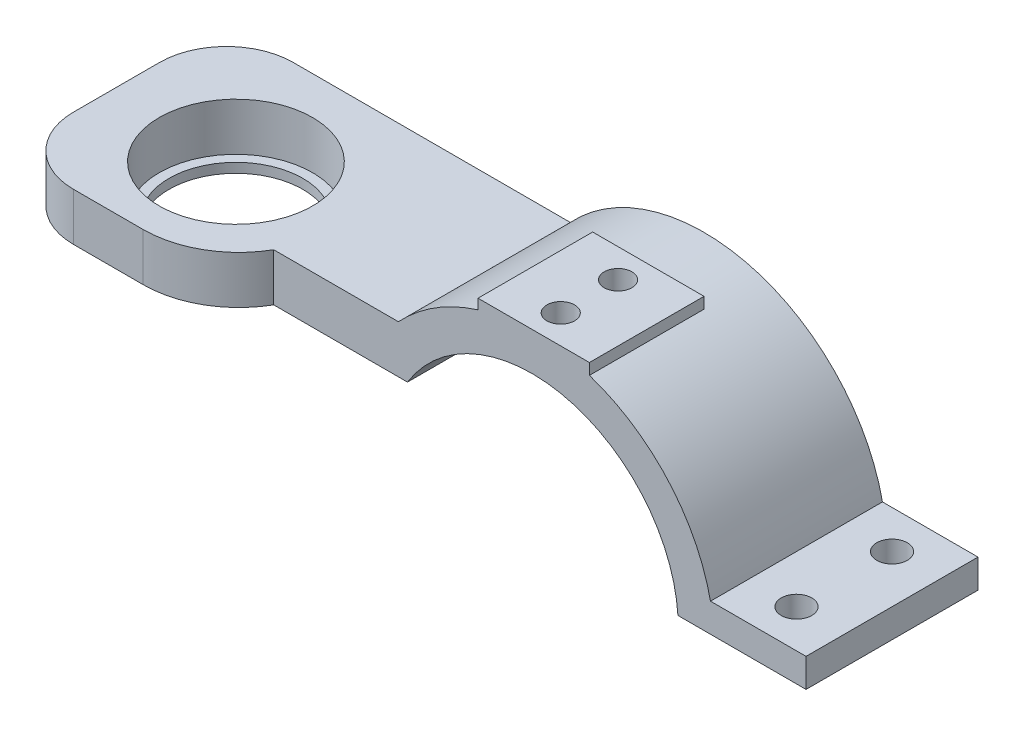
ISO-10303-21;
HEADER;
FILE_DESCRIPTION(('STEP AP214'),'2;1');
FILE_NAME('part.step','',(''),(''),'','','');
FILE_SCHEMA(('AUTOMOTIVE_DESIGN { 1 0 10303 214 1 1 1 1 }'));
ENDSEC;
DATA;
#1=APPLICATION_CONTEXT('core data for automotive mechanical design processes');
#2=APPLICATION_PROTOCOL_DEFINITION('international standard','automotive_design',2000,#1);
#3=PRODUCT_CONTEXT('',#1,'mechanical');
#4=PRODUCT('Part','Part','',(#3));
#5=PRODUCT_RELATED_PRODUCT_CATEGORY('part','',(#4));
#6=PRODUCT_DEFINITION_FORMATION('','',#4);
#7=PRODUCT_DEFINITION_CONTEXT('part definition',#1,'design');
#8=PRODUCT_DEFINITION('design','',#6,#7);
#9=PRODUCT_DEFINITION_SHAPE('','',#8);
#10=(LENGTH_UNIT() NAMED_UNIT(*) SI_UNIT(.MILLI.,.METRE.));
#11=(NAMED_UNIT(*) PLANE_ANGLE_UNIT() SI_UNIT($,.RADIAN.));
#12=(NAMED_UNIT(*) SI_UNIT($,.STERADIAN.) SOLID_ANGLE_UNIT());
#13=UNCERTAINTY_MEASURE_WITH_UNIT(LENGTH_MEASURE(1.E-05),#10,'distance_accuracy_value','');
#14=(GEOMETRIC_REPRESENTATION_CONTEXT(3) GLOBAL_UNCERTAINTY_ASSIGNED_CONTEXT((#13)) GLOBAL_UNIT_ASSIGNED_CONTEXT((#10,
#11,#12)) REPRESENTATION_CONTEXT('',''));
#15=CARTESIAN_POINT('',(0.,0.,0.));
#16=DIRECTION('',(0.,0.,1.));
#17=DIRECTION('',(1.,0.,0.));
#18=AXIS2_PLACEMENT_3D('',#15,#16,#17);
#19=CARTESIAN_POINT('',(0.,0.,18.));
#20=DIRECTION('',(0.,0.,1.));
#21=DIRECTION('',(1.,0.,0.));
#22=AXIS2_PLACEMENT_3D('',#19,#20,#21);
#23=PLANE('',#22);
#24=CARTESIAN_POINT('',(0.,0.,18.));
#25=DIRECTION('',(0.,0.,1.));
#26=DIRECTION('',(1.,0.,0.));
#27=AXIS2_PLACEMENT_3D('',#24,#25,#26);
#28=CIRCLE('',#27,19.1);
#29=CARTESIAN_POINT('',(18.6764557665527,4.,18.));
#30=VERTEX_POINT('',#29);
#31=CARTESIAN_POINT('',(6.,18.1331188712808,18.));
#32=VERTEX_POINT('',#31);
#33=EDGE_CURVE('E259',#30,#32,#28,.T.);
#34=ORIENTED_EDGE('',*,*,#33,.T.);
#35=DIRECTION('',(0.,1.,0.));
#36=VECTOR('',#35,1.);
#37=CARTESIAN_POINT('',(6.,18.1331188712808,18.));
#38=LINE('',#37,#36);
#39=CARTESIAN_POINT('',(6.,19.3,18.));
#40=VERTEX_POINT('',#39);
#41=EDGE_CURVE('E166',#32,#40,#38,.T.);
#42=ORIENTED_EDGE('',*,*,#41,.T.);
#43=DIRECTION('',(-1.,0.,0.));
#44=VECTOR('',#43,1.);
#45=CARTESIAN_POINT('',(6.,19.3,18.));
#46=LINE('',#45,#44);
#47=CARTESIAN_POINT('',(-5.66,19.3,18.));
#48=VERTEX_POINT('',#47);
#49=EDGE_CURVE('E410',#40,#48,#46,.T.);
#50=ORIENTED_EDGE('',*,*,#49,.T.);
#51=DIRECTION('',(0.,-1.,0.));
#52=VECTOR('',#51,1.);
#53=CARTESIAN_POINT('',(-5.66,19.3,18.));
#54=LINE('',#53,#52);
#55=CARTESIAN_POINT('',(-5.65999999999999,18.242105141677,18.));
#56=VERTEX_POINT('',#55);
#57=EDGE_CURVE('E61',#48,#56,#54,.T.);
#58=ORIENTED_EDGE('',*,*,#57,.T.);
#59=CARTESIAN_POINT('',(-13.9932126404196,13.,18.));
#60=VERTEX_POINT('',#59);
#61=EDGE_CURVE('E189',#56,#60,#28,.T.);
#62=ORIENTED_EDGE('',*,*,#61,.T.);
#63=DIRECTION('',(-1.,0.,0.));
#64=VECTOR('',#63,1.);
#65=CARTESIAN_POINT('',(-50.,13.,18.));
#66=LINE('',#65,#64);
#67=CARTESIAN_POINT('',(-27.0418556961807,13.,18.));
#68=VERTEX_POINT('',#67);
#69=EDGE_CURVE('E262',#60,#68,#66,.T.);
#70=ORIENTED_EDGE('',*,*,#69,.T.);
#71=DIRECTION('',(0.,-1.,0.));
#72=VECTOR('',#71,1.);
#73=CARTESIAN_POINT('',(-27.0418556961807,36.496305877201,18.));
#74=LINE('',#73,#72);
#75=CARTESIAN_POINT('',(-27.0418556961807,8.,18.));
#76=VERTEX_POINT('',#75);
#77=EDGE_CURVE('E222',#68,#76,#74,.T.);
#78=ORIENTED_EDGE('',*,*,#77,.T.);
#79=DIRECTION('',(1.,0.,0.));
#80=VECTOR('',#79,1.);
#81=CARTESIAN_POINT('',(-13.0418556961807,8.,18.));
#82=LINE('',#81,#80);
#83=CARTESIAN_POINT('',(-13.0418556961807,8.,18.));
#84=VERTEX_POINT('',#83);
#85=EDGE_CURVE('E266',#76,#84,#82,.T.);
#86=ORIENTED_EDGE('',*,*,#85,.T.);
#87=CARTESIAN_POINT('',(0.,0.,18.));
#88=DIRECTION('',(0.,0.,-1.));
#89=DIRECTION('',(1.,0.,0.));
#90=AXIS2_PLACEMENT_3D('',#87,#88,#89);
#91=CIRCLE('',#90,15.3);
#92=CARTESIAN_POINT('',(15.2672852858653,1.,18.));
#93=VERTEX_POINT('',#92);
#94=EDGE_CURVE('E245',#84,#93,#91,.T.);
#95=ORIENTED_EDGE('',*,*,#94,.T.);
#96=DIRECTION('',(1.,0.,0.));
#97=VECTOR('',#96,1.);
#98=CARTESIAN_POINT('',(15.2672852858653,1.,18.));
#99=LINE('',#98,#97);
#100=CARTESIAN_POINT('',(28.6764557665527,1.,18.));
#101=VERTEX_POINT('',#100);
#102=EDGE_CURVE('E249',#93,#101,#99,.T.);
#103=ORIENTED_EDGE('',*,*,#102,.T.);
#104=DIRECTION('',(0.,1.,0.));
#105=VECTOR('',#104,1.);
#106=CARTESIAN_POINT('',(28.6764557665527,4.,18.));
#107=LINE('',#106,#105);
#108=CARTESIAN_POINT('',(28.6764557665527,4.,18.));
#109=VERTEX_POINT('',#108);
#110=EDGE_CURVE('E253',#101,#109,#107,.T.);
#111=ORIENTED_EDGE('',*,*,#110,.T.);
#112=DIRECTION('',(-1.,0.,0.));
#113=VECTOR('',#112,1.);
#114=CARTESIAN_POINT('',(18.6764557665527,4.,18.));
#115=LINE('',#114,#113);
#116=EDGE_CURVE('E256',#109,#30,#115,.T.);
#117=ORIENTED_EDGE('',*,*,#116,.T.);
#118=EDGE_LOOP('',(#34,#42,#50,#58,#62,#70,#78,#86,#95,#103,#111,#117));
#119=FACE_BOUND('',#118,.T.);
#120=ADVANCED_FACE('F45',(#119),#23,.T.);
#121=CARTESIAN_POINT('',(0.,0.,18.));
#122=DIRECTION('',(0.,0.,-1.));
#123=DIRECTION('',(-1.,0.,0.));
#124=AXIS2_PLACEMENT_3D('',#121,#122,#123);
#125=CYLINDRICAL_SURFACE('',#124,15.3);
#126=CARTESIAN_POINT('',(0.,15.3,16.45));
#127=CARTESIAN_POINT('',(0.0812515991142667,15.2999991091432,16.4499964709198));
#128=CARTESIAN_POINT('',(0.16255744898968,15.2993458775758,16.443147542065));
#129=CARTESIAN_POINT('',(0.322916548267007,15.2968028186071,16.4159283613467));
#130=CARTESIAN_POINT('',(0.401967190413606,15.2949116159926,16.3955430721103));
#131=CARTESIAN_POINT('',(0.555470386419923,15.2901061751943,16.3418486228883));
#132=CARTESIAN_POINT('',(0.629925628930525,15.28719254201,16.3085471045573));
#133=CARTESIAN_POINT('',(0.772172919661824,15.2806683523542,16.2299799604515));
#134=CARTESIAN_POINT('',(0.839966322342499,15.2770579379938,16.1847167736109));
#135=CARTESIAN_POINT('',(0.967202576648075,15.269531734915,16.0833530276106));
#136=CARTESIAN_POINT('',(1.02662075828161,15.2656150947734,16.0272215619558));
#137=CARTESIAN_POINT('',(1.13520798076871,15.2579249442009,15.9057803788205));
#138=CARTESIAN_POINT('',(1.18437655567673,15.2541514402833,15.8404702443049));
#139=CARTESIAN_POINT('',(1.27115507340336,15.2471659813123,15.7023727293474));
#140=CARTESIAN_POINT('',(1.30874288476061,15.2439551064594,15.6295713824857));
#141=CARTESIAN_POINT('',(1.37115156566787,15.2384687758788,15.4786550089068));
#142=CARTESIAN_POINT('',(1.39597272054443,15.2361932992458,15.4005401009883));
#143=CARTESIAN_POINT('',(1.43207083921573,15.2328429442271,15.2414643266713));
#144=CARTESIAN_POINT('',(1.44338851000812,15.231764458137,15.160512774918));
#145=CARTESIAN_POINT('',(1.45228420106818,15.230918935861,14.9978524685594));
#146=CARTESIAN_POINT('',(1.44986254799758,15.2311518684952,14.9161437320028));
#147=CARTESIAN_POINT('',(1.43138191405666,15.2328995752187,14.7545685243348));
#148=CARTESIAN_POINT('',(1.41536731053698,15.234410178,14.6746969259849));
#149=CARTESIAN_POINT('',(1.37022438665792,15.2385364945202,14.518780354853));
#150=CARTESIAN_POINT('',(1.34109590542635,15.2411522218159,14.4427354290267));
#151=CARTESIAN_POINT('',(1.27050285874312,15.2471988631139,14.2964902404687));
#152=CARTESIAN_POINT('',(1.22901853087671,15.2506310812593,14.2262995732322));
#153=CARTESIAN_POINT('',(1.1349055939976,15.2579228460782,14.0938603356113));
#154=CARTESIAN_POINT('',(1.08227669224086,15.261782403976,14.031611973923));
#155=CARTESIAN_POINT('',(0.967120343511109,15.2695125534767,13.916566422873));
#156=CARTESIAN_POINT('',(0.90455455804106,15.2733831283201,13.8638076001931));
#157=CARTESIAN_POINT('',(0.771433789286605,15.2806847360842,13.7695358848851));
#158=CARTESIAN_POINT('',(0.700878798369754,15.284115768585,13.7280230030009));
#159=CARTESIAN_POINT('',(0.553756380980498,15.2901526701683,13.6574233894373));
#160=CARTESIAN_POINT('',(0.477188054543367,15.2927584154423,13.6283385219644));
#161=CARTESIAN_POINT('',(0.320224630496182,15.2968498365577,13.5834482491451));
#162=CARTESIAN_POINT('',(0.239829635703252,15.2983355424748,13.5676424872206));
#163=CARTESIAN_POINT('',(0.0778273497443185,15.3000156246718,13.5498075759987));
#164=CARTESIAN_POINT('',(-0.0037740616934729,15.3002149650309,13.5477254665168));
#165=CARTESIAN_POINT('',(-0.166164710833336,15.2993131492001,13.5572579854139));
#166=CARTESIAN_POINT('',(-0.246953958360673,15.2982120087622,13.5688724478953));
#167=CARTESIAN_POINT('',(-0.405274728054278,15.2948361843755,13.6054244958345));
#168=CARTESIAN_POINT('',(-0.482812006407379,15.2925636775976,13.6303373671276));
#169=CARTESIAN_POINT('',(-0.632606558132375,15.2871001764658,13.6927537016806));
#170=CARTESIAN_POINT('',(-0.704863724578483,15.2839091635179,13.7302574198276));
#171=CARTESIAN_POINT('',(-0.842286908482688,15.2769534716161,13.8169227786372));
#172=CARTESIAN_POINT('',(-0.907430833718773,15.2731870879733,13.8661193114166));
#173=CARTESIAN_POINT('',(-1.02855491693736,15.2655090069387,13.9747236370309));
#174=CARTESIAN_POINT('',(-1.08453486860725,15.2615973062777,14.0341316597));
#175=CARTESIAN_POINT('',(-1.18592508547687,15.2540546066878,14.1617032525118));
#176=CARTESIAN_POINT('',(-1.23130065836996,15.2504245543453,14.2298944589093));
#177=CARTESIAN_POINT('',(-1.30995578792696,15.2438702511028,14.3729599960022));
#178=CARTESIAN_POINT('',(-1.34323549532968,15.2409459914072,14.4478342433989));
#179=CARTESIAN_POINT('',(-1.39669578682737,15.2361400988762,14.6020201958947));
#180=CARTESIAN_POINT('',(-1.41689721070976,15.2342568079972,14.681324621483));
#181=CARTESIAN_POINT('',(-1.44369518774856,15.2317408146306,14.8422185285275));
#182=CARTESIAN_POINT('',(-1.4502920879007,15.2311080802465,14.923807951649));
#183=CARTESIAN_POINT('',(-1.44968921325221,15.2311654471207,15.0866110355672));
#184=CARTESIAN_POINT('',(-1.4425439386099,15.231850322866,15.1678249055439));
#185=CARTESIAN_POINT('',(-1.41477360506399,15.2344546133188,15.3278932145747));
#186=CARTESIAN_POINT('',(-1.3941485290337,15.2363740295947,15.4067476506308));
#187=CARTESIAN_POINT('',(-1.3400187034686,15.2412297073439,15.5598595833221));
#188=CARTESIAN_POINT('',(-1.30651535409957,15.2441658582711,15.6341175786779));
#189=CARTESIAN_POINT('',(-1.2275857666815,15.2507243943616,15.7759645145542));
#190=CARTESIAN_POINT('',(-1.1821596352912,15.2543467733859,15.8435535147266));
#191=CARTESIAN_POINT('',(-1.0804691148909,15.2618867936987,15.970423121208));
#192=CARTESIAN_POINT('',(-1.02416417105721,15.2658055053246,16.0296711582808));
#193=CARTESIAN_POINT('',(-0.902392878387768,15.2734868560174,16.1379030469461));
#194=CARTESIAN_POINT('',(-0.836924331174346,15.2772494573514,16.1868844284722));
#195=CARTESIAN_POINT('',(-0.69852226194242,15.2842034493593,16.2732789413874));
#196=CARTESIAN_POINT('',(-0.625571945127441,15.2873935086706,16.3106652533046));
#197=CARTESIAN_POINT('',(-0.474446545448694,15.2928281938523,16.3726087441107));
#198=CARTESIAN_POINT('',(-0.396277506200712,15.2950738920792,16.3971804820746));
#199=CARTESIAN_POINT('',(-0.264716351117885,15.2977984651584,16.426626561583));
#200=CARTESIAN_POINT('',(-0.212166999669702,15.2986202215285,16.4353797342677));
#201=CARTESIAN_POINT('',(-0.106419522696149,15.2997212797339,16.4470675987753));
#202=CARTESIAN_POINT('',(-0.0532213995151396,15.3000005835288,16.4500023116171));
#203=CARTESIAN_POINT('',(0.,15.3,16.45));
#204=B_SPLINE_CURVE_WITH_KNOTS('',3,(#126,#127,#128,#129,#130,#131,#132,#133,#134,#135,#136,
#137,#138,#139,#140,#141,#142,#143,#144,#145,#146,#147,#148,#149,#150,#151,#152,#153,#154,#155,
#156,#157,#158,#159,#160,#161,#162,#163,#164,#165,#166,#167,#168,#169,#170,#171,#172,#173,#174,
#175,#176,#177,#178,#179,#180,#181,#182,#183,#184,#185,#186,#187,#188,#189,#190,#191,#192,#193,
#194,#195,#196,#197,#198,#199,#200,#201,#202,#203),.UNSPECIFIED.,.T.,.F.,(4,2,2,2,2,2,2,2,2,2,2,
2,2,2,2,2,2,2,2,2,2,2,2,2,2,2,2,2,2,2,2,2,2,2,2,2,2,2,4),(0.,0.243560462248795,
0.487391946423289,0.731079391599901,0.974717188212017,1.21905828097242,1.46341047902038,
1.70822679150146,1.95303763225799,2.19710859742689,2.4411737596676,2.6844451656828,
2.92771955606851,3.17138515766205,3.41505716062242,3.65969321974091,3.90432951257313,
4.14900248806394,4.39366889324752,4.637390564306,4.88110928335126,5.124376637073,
5.36764891575645,5.61165645641248,5.85566948976357,6.10046997503975,6.34526740950471,
6.58967380139682,6.83407395940485,7.07750684801378,7.32094004591551,7.56434678448848,
7.80775134566935,8.05208143334323,8.29647023737089,8.54142016966889,8.7860911963558,
8.9456286779067,9.10516558313369),.UNSPECIFIED.);
#205=CARTESIAN_POINT('',(0.,15.3,16.45));
#206=VERTEX_POINT('',#205);
#207=EDGE_CURVE('E412',#206,#206,#204,.T.);
#208=ORIENTED_EDGE('',*,*,#207,.T.);
#209=EDGE_LOOP('',(#208));
#210=FACE_BOUND('',#209,.T.);
#211=CARTESIAN_POINT('',(0.,15.3,10.45));
#212=CARTESIAN_POINT('',(0.0812515991142664,15.2999991091432,10.4499964709198));
#213=CARTESIAN_POINT('',(0.162557448989679,15.2993458775758,10.443147542065));
#214=CARTESIAN_POINT('',(0.322916548267007,15.2968028186071,10.4159283613467));
#215=CARTESIAN_POINT('',(0.401967190413606,15.2949116159926,10.3955430721103));
#216=CARTESIAN_POINT('',(0.555470386419923,15.2901061751943,10.3418486228883));
#217=CARTESIAN_POINT('',(0.629925628930526,15.28719254201,10.3085471045573));
#218=CARTESIAN_POINT('',(0.772172919661824,15.2806683523542,10.2299799604515));
#219=CARTESIAN_POINT('',(0.839966322342499,15.2770579379938,10.1847167736109));
#220=CARTESIAN_POINT('',(0.967202576648075,15.269531734915,10.0833530276106));
#221=CARTESIAN_POINT('',(1.02662075828161,15.2656150947734,10.0272215619558));
#222=CARTESIAN_POINT('',(1.13520798076871,15.2579249442009,9.90578037882047));
#223=CARTESIAN_POINT('',(1.18437655567673,15.2541514402833,9.84047024430494));
#224=CARTESIAN_POINT('',(1.27115507340337,15.2471659813123,9.70237272934738));
#225=CARTESIAN_POINT('',(1.30874288476061,15.2439551064594,9.62957138248573));
#226=CARTESIAN_POINT('',(1.37115156566787,15.2384687758788,9.47865500890677));
#227=CARTESIAN_POINT('',(1.39597272054443,15.2361932992458,9.40054010098831));
#228=CARTESIAN_POINT('',(1.43207083921573,15.2328429442271,9.24146432667128));
#229=CARTESIAN_POINT('',(1.44338851000812,15.231764458137,9.16051277491802));
#230=CARTESIAN_POINT('',(1.45228420106818,15.230918935861,8.99785246855942));
#231=CARTESIAN_POINT('',(1.44986254799758,15.2311518684952,8.91614373200277));
#232=CARTESIAN_POINT('',(1.43138191405666,15.2328995752187,8.75456852433481));
#233=CARTESIAN_POINT('',(1.41536731053698,15.234410178,8.67469692598487));
#234=CARTESIAN_POINT('',(1.37022438665792,15.2385364945202,8.51878035485296));
#235=CARTESIAN_POINT('',(1.34109590542635,15.2411522218159,8.44273542902675));
#236=CARTESIAN_POINT('',(1.27050285874312,15.2471988631139,8.2964902404687));
#237=CARTESIAN_POINT('',(1.22901853087671,15.2506310812593,8.22629957323224));
#238=CARTESIAN_POINT('',(1.1349055939976,15.2579228460782,8.09386033561128));
#239=CARTESIAN_POINT('',(1.08227669224087,15.261782403976,8.03161197392297));
#240=CARTESIAN_POINT('',(0.967120343511111,15.2695125534767,7.91656642287304));
#241=CARTESIAN_POINT('',(0.904554558041061,15.2733831283201,7.86380760019306));
#242=CARTESIAN_POINT('',(0.771433789286606,15.2806847360842,7.76953588488506));
#243=CARTESIAN_POINT('',(0.700878798369754,15.284115768585,7.72802300300092));
#244=CARTESIAN_POINT('',(0.553756380980498,15.2901526701683,7.65742338943734));
#245=CARTESIAN_POINT('',(0.477188054543367,15.2927584154423,7.62833852196441));
#246=CARTESIAN_POINT('',(0.320224630496182,15.2968498365577,7.58344824914506));
#247=CARTESIAN_POINT('',(0.239829635703252,15.2983355424748,7.5676424872206));
#248=CARTESIAN_POINT('',(0.0778273497443191,15.3000156246718,7.54980757599874));
#249=CARTESIAN_POINT('',(-0.00377406169347209,15.3002149650309,7.54772546651675));
#250=CARTESIAN_POINT('',(-0.166164710833335,15.2993131492001,7.55725798541393));
#251=CARTESIAN_POINT('',(-0.246953958360672,15.2982120087622,7.56887244789535));
#252=CARTESIAN_POINT('',(-0.405274728054277,15.2948361843755,7.60542449583449));
#253=CARTESIAN_POINT('',(-0.482812006407379,15.2925636775976,7.63033736712763));
#254=CARTESIAN_POINT('',(-0.632606558132375,15.2871001764658,7.69275370168063));
#255=CARTESIAN_POINT('',(-0.704863724578482,15.2839091635179,7.73025741982755));
#256=CARTESIAN_POINT('',(-0.842286908482687,15.2769534716161,7.81692277863721));
#257=CARTESIAN_POINT('',(-0.907430833718773,15.2731870879733,7.86611931141658));
#258=CARTESIAN_POINT('',(-1.02855491693736,15.2655090069387,7.9747236370309));
#259=CARTESIAN_POINT('',(-1.08453486860725,15.2615973062777,8.03413165969997));
#260=CARTESIAN_POINT('',(-1.18592508547687,15.2540546066878,8.16170325251179));
#261=CARTESIAN_POINT('',(-1.23130065836996,15.2504245543453,8.22989445890932));
#262=CARTESIAN_POINT('',(-1.30995578792696,15.2438702511028,8.37295999600219));
#263=CARTESIAN_POINT('',(-1.34323549532968,15.2409459914072,8.44783424339892));
#264=CARTESIAN_POINT('',(-1.39669578682737,15.2361400988762,8.6020201958947));
#265=CARTESIAN_POINT('',(-1.41689721070976,15.2342568079972,8.68132462148301));
#266=CARTESIAN_POINT('',(-1.44369518774856,15.2317408146306,8.84221852852752));
#267=CARTESIAN_POINT('',(-1.4502920879007,15.2311080802465,8.92380795164899));
#268=CARTESIAN_POINT('',(-1.44968921325221,15.2311654471207,9.08661103556718));
#269=CARTESIAN_POINT('',(-1.4425439386099,15.231850322866,9.16782490554394));
#270=CARTESIAN_POINT('',(-1.41477360506399,15.2344546133188,9.32789321457468));
#271=CARTESIAN_POINT('',(-1.3941485290337,15.2363740295947,9.40674765063076));
#272=CARTESIAN_POINT('',(-1.3400187034686,15.2412297073439,9.55985958332207));
#273=CARTESIAN_POINT('',(-1.30651535409957,15.2441658582711,9.63411757867791));
#274=CARTESIAN_POINT('',(-1.2275857666815,15.2507243943616,9.77596451455418));
#275=CARTESIAN_POINT('',(-1.1821596352912,15.2543467733859,9.84355351472663));
#276=CARTESIAN_POINT('',(-1.0804691148909,15.2618867936987,9.97042312120795));
#277=CARTESIAN_POINT('',(-1.02416417105721,15.2658055053246,10.0296711582808));
#278=CARTESIAN_POINT('',(-0.902392878387768,15.2734868560174,10.1379030469461));
#279=CARTESIAN_POINT('',(-0.836924331174346,15.2772494573514,10.1868844284722));
#280=CARTESIAN_POINT('',(-0.698522261942419,15.2842034493593,10.2732789413874));
#281=CARTESIAN_POINT('',(-0.625571945127441,15.2873935086706,10.3106652533046));
#282=CARTESIAN_POINT('',(-0.474446545448695,15.2928281938523,10.3726087441107));
#283=CARTESIAN_POINT('',(-0.396277506200714,15.2950738920792,10.3971804820746));
#284=CARTESIAN_POINT('',(-0.264716351117886,15.2977984651584,10.426626561583));
#285=CARTESIAN_POINT('',(-0.212166999669702,15.2986202215285,10.4353797342677));
#286=CARTESIAN_POINT('',(-0.106419522696149,15.2997212797339,10.4470675987753));
#287=CARTESIAN_POINT('',(-0.0532213995151395,15.3000005835288,10.4500023116171));
#288=CARTESIAN_POINT('',(0.,15.3,10.45));
#289=B_SPLINE_CURVE_WITH_KNOTS('',3,(#211,#212,#213,#214,#215,#216,#217,#218,#219,#220,#221,
#222,#223,#224,#225,#226,#227,#228,#229,#230,#231,#232,#233,#234,#235,#236,#237,#238,#239,#240,
#241,#242,#243,#244,#245,#246,#247,#248,#249,#250,#251,#252,#253,#254,#255,#256,#257,#258,#259,
#260,#261,#262,#263,#264,#265,#266,#267,#268,#269,#270,#271,#272,#273,#274,#275,#276,#277,#278,
#279,#280,#281,#282,#283,#284,#285,#286,#287,#288),.UNSPECIFIED.,.T.,.F.,(4,2,2,2,2,2,2,2,2,2,2,
2,2,2,2,2,2,2,2,2,2,2,2,2,2,2,2,2,2,2,2,2,2,2,2,2,2,2,4),(0.,0.243560462248794,
0.487391946423288,0.731079391599903,0.974717188212017,1.21905828097242,1.46341047902038,
1.70822679150146,1.95303763225799,2.19710859742689,2.4411737596676,2.6844451656828,
2.92771955606851,3.17138515766205,3.41505716062242,3.6596932197409,3.90432951257313,
4.14900248806394,4.39366889324752,4.637390564306,4.88110928335126,5.124376637073,
5.36764891575645,5.61165645641248,5.85566948976357,6.10046997503975,6.34526740950471,
6.58967380139682,6.83407395940485,7.07750684801379,7.32094004591551,7.56434678448849,
7.80775134566935,8.05208143334324,8.29647023737089,8.54142016966889,8.78609119635581,
8.9456286779067,9.1051655831337),.UNSPECIFIED.);
#290=CARTESIAN_POINT('',(0.,15.3,10.45));
#291=VERTEX_POINT('',#290);
#292=EDGE_CURVE('E417',#291,#291,#289,.T.);
#293=ORIENTED_EDGE('',*,*,#292,.T.);
#294=EDGE_LOOP('',(#293));
#295=FACE_BOUND('',#294,.T.);
#296=CARTESIAN_POINT('',(0.,0.,0.));
#297=DIRECTION('',(0.,0.,-1.));
#298=DIRECTION('',(1.,0.,0.));
#299=AXIS2_PLACEMENT_3D('',#296,#297,#298);
#300=CIRCLE('',#299,15.3);
#301=CARTESIAN_POINT('',(-13.0418556961807,8.,0.));
#302=VERTEX_POINT('',#301);
#303=CARTESIAN_POINT('',(15.2672852858653,1.,0.));
#304=VERTEX_POINT('',#303);
#305=EDGE_CURVE('E233',#302,#304,#300,.T.);
#306=ORIENTED_EDGE('',*,*,#305,.T.);
#307=DIRECTION('',(0.,0.,-1.));
#308=VECTOR('',#307,1.);
#309=CARTESIAN_POINT('',(15.2672852858653,1.,18.));
#310=LINE('',#309,#308);
#311=EDGE_CURVE('E318',#93,#304,#310,.T.);
#312=ORIENTED_EDGE('',*,*,#311,.F.);
#313=ORIENTED_EDGE('',*,*,#94,.F.);
#314=DIRECTION('',(0.,0.,-1.));
#315=VECTOR('',#314,1.);
#316=CARTESIAN_POINT('',(-13.0418556961807,8.,18.));
#317=LINE('',#316,#315);
#318=EDGE_CURVE('E269',#84,#302,#317,.T.);
#319=ORIENTED_EDGE('',*,*,#318,.T.);
#320=EDGE_LOOP('',(#306,#312,#313,#319));
#321=FACE_BOUND('',#320,.T.);
#322=ADVANCED_FACE('F394',(#210,#295,#321),#125,.F.);
#323=CARTESIAN_POINT('',(15.2672852858653,1.,18.));
#324=DIRECTION('',(0.,1.,0.));
#325=DIRECTION('',(0.,0.,1.));
#326=AXIS2_PLACEMENT_3D('',#323,#324,#325);
#327=PLANE('',#326);
#328=CARTESIAN_POINT('',(23.6764557665527,1.,4.));
#329=DIRECTION('',(0.,1.,0.));
#330=DIRECTION('',(0.,0.,1.));
#331=AXIS2_PLACEMENT_3D('',#328,#329,#330);
#332=CIRCLE('',#331,1.6);
#333=CARTESIAN_POINT('',(23.6764557665527,1.,5.6));
#334=VERTEX_POINT('',#333);
#335=EDGE_CURVE('E229',#334,#334,#332,.T.);
#336=ORIENTED_EDGE('',*,*,#335,.T.);
#337=EDGE_LOOP('',(#336));
#338=FACE_BOUND('',#337,.T.);
#339=CARTESIAN_POINT('',(23.6764557665527,1.,14.));
#340=DIRECTION('',(0.,1.,0.));
#341=DIRECTION('',(0.,0.,1.));
#342=AXIS2_PLACEMENT_3D('',#339,#340,#341);
#343=CIRCLE('',#342,1.6);
#344=CARTESIAN_POINT('',(23.6764557665527,1.,15.6));
#345=VERTEX_POINT('',#344);
#346=EDGE_CURVE('E221',#345,#345,#343,.T.);
#347=ORIENTED_EDGE('',*,*,#346,.T.);
#348=EDGE_LOOP('',(#347));
#349=FACE_BOUND('',#348,.T.);
#350=DIRECTION('',(1.,0.,0.));
#351=VECTOR('',#350,1.);
#352=CARTESIAN_POINT('',(15.2672852858653,1.,0.));
#353=LINE('',#352,#351);
#354=CARTESIAN_POINT('',(28.6764557665527,1.,0.));
#355=VERTEX_POINT('',#354);
#356=EDGE_CURVE('E273',#304,#355,#353,.T.);
#357=ORIENTED_EDGE('',*,*,#356,.T.);
#358=DIRECTION('',(0.,0.,-1.));
#359=VECTOR('',#358,1.);
#360=CARTESIAN_POINT('',(28.6764557665527,1.,18.));
#361=LINE('',#360,#359);
#362=EDGE_CURVE('E314',#101,#355,#361,.T.);
#363=ORIENTED_EDGE('',*,*,#362,.F.);
#364=ORIENTED_EDGE('',*,*,#102,.F.);
#365=ORIENTED_EDGE('',*,*,#311,.T.);
#366=EDGE_LOOP('',(#357,#363,#364,#365));
#367=FACE_BOUND('',#366,.T.);
#368=ADVANCED_FACE('F400',(#338,#349,#367),#327,.F.);
#369=CARTESIAN_POINT('',(28.6764557665527,4.,18.));
#370=DIRECTION('',(-1.,0.,0.));
#371=DIRECTION('',(0.,0.,1.));
#372=AXIS2_PLACEMENT_3D('',#369,#370,#371);
#373=PLANE('',#372);
#374=DIRECTION('',(0.,1.,0.));
#375=VECTOR('',#374,1.);
#376=CARTESIAN_POINT('',(28.6764557665527,4.,0.));
#377=LINE('',#376,#375);
#378=CARTESIAN_POINT('',(28.6764557665527,4.,0.));
#379=VERTEX_POINT('',#378);
#380=EDGE_CURVE('E276',#355,#379,#377,.T.);
#381=ORIENTED_EDGE('',*,*,#380,.T.);
#382=DIRECTION('',(0.,0.,-1.));
#383=VECTOR('',#382,1.);
#384=CARTESIAN_POINT('',(28.6764557665527,4.,18.));
#385=LINE('',#384,#383);
#386=EDGE_CURVE('E310',#109,#379,#385,.T.);
#387=ORIENTED_EDGE('',*,*,#386,.F.);
#388=ORIENTED_EDGE('',*,*,#110,.F.);
#389=ORIENTED_EDGE('',*,*,#362,.T.);
#390=EDGE_LOOP('',(#381,#387,#388,#389));
#391=FACE_BOUND('',#390,.T.);
#392=ADVANCED_FACE('F402',(#391),#373,.F.);
#393=CARTESIAN_POINT('',(18.6764557665527,4.,18.));
#394=DIRECTION('',(0.,-1.,0.));
#395=DIRECTION('',(0.,0.,-1.));
#396=AXIS2_PLACEMENT_3D('',#393,#394,#395);
#397=PLANE('',#396);
#398=CARTESIAN_POINT('',(23.6764557665527,4.,4.));
#399=DIRECTION('',(0.,1.,0.));
#400=DIRECTION('',(0.,0.,1.));
#401=AXIS2_PLACEMENT_3D('',#398,#399,#400);
#402=CIRCLE('',#401,1.6);
#403=CARTESIAN_POINT('',(23.6764557665527,4.,5.6));
#404=VERTEX_POINT('',#403);
#405=EDGE_CURVE('E234',#404,#404,#402,.T.);
#406=ORIENTED_EDGE('',*,*,#405,.F.);
#407=EDGE_LOOP('',(#406));
#408=FACE_BOUND('',#407,.T.);
#409=CARTESIAN_POINT('',(23.6764557665527,4.,14.));
#410=DIRECTION('',(0.,1.,0.));
#411=DIRECTION('',(0.,0.,1.));
#412=AXIS2_PLACEMENT_3D('',#409,#410,#411);
#413=CIRCLE('',#412,1.6);
#414=CARTESIAN_POINT('',(23.6764557665527,4.,15.6));
#415=VERTEX_POINT('',#414);
#416=EDGE_CURVE('E238',#415,#415,#413,.T.);
#417=ORIENTED_EDGE('',*,*,#416,.F.);
#418=EDGE_LOOP('',(#417));
#419=FACE_BOUND('',#418,.T.);
#420=DIRECTION('',(-1.,0.,0.));
#421=VECTOR('',#420,1.);
#422=CARTESIAN_POINT('',(18.6764557665527,4.,0.));
#423=LINE('',#422,#421);
#424=CARTESIAN_POINT('',(18.6764557665527,4.,0.));
#425=VERTEX_POINT('',#424);
#426=EDGE_CURVE('E279',#379,#425,#423,.T.);
#427=ORIENTED_EDGE('',*,*,#426,.T.);
#428=DIRECTION('',(0.,0.,-1.));
#429=VECTOR('',#428,1.);
#430=CARTESIAN_POINT('',(18.6764557665527,4.,18.));
#431=LINE('',#430,#429);
#432=EDGE_CURVE('E306',#30,#425,#431,.T.);
#433=ORIENTED_EDGE('',*,*,#432,.F.);
#434=ORIENTED_EDGE('',*,*,#116,.F.);
#435=ORIENTED_EDGE('',*,*,#386,.T.);
#436=EDGE_LOOP('',(#427,#433,#434,#435));
#437=FACE_BOUND('',#436,.T.);
#438=ADVANCED_FACE('F407',(#408,#419,#437),#397,.F.);
#439=CARTESIAN_POINT('',(0.,0.,18.));
#440=DIRECTION('',(0.,0.,-1.));
#441=DIRECTION('',(-1.,0.,0.));
#442=AXIS2_PLACEMENT_3D('',#439,#440,#441);
#443=CYLINDRICAL_SURFACE('',#442,19.1);
#444=ORIENTED_EDGE('',*,*,#61,.F.);
#445=DIRECTION('',(0.,0.,1.));
#446=VECTOR('',#445,1.);
#447=CARTESIAN_POINT('',(-5.66,18.242105141677,6.));
#448=LINE('',#447,#446);
#449=CARTESIAN_POINT('',(-5.66,18.242105141677,6.));
#450=VERTEX_POINT('',#449);
#451=EDGE_CURVE('E187',#450,#56,#448,.T.);
#452=ORIENTED_EDGE('',*,*,#451,.F.);
#453=CARTESIAN_POINT('',(0.,0.,6.));
#454=DIRECTION('',(0.,0.,1.));
#455=DIRECTION('',(1.,0.,0.));
#456=AXIS2_PLACEMENT_3D('',#453,#454,#455);
#457=CIRCLE('',#456,19.1);
#458=CARTESIAN_POINT('',(6.,18.1331188712808,6.));
#459=VERTEX_POINT('',#458);
#460=EDGE_CURVE('E11',#459,#450,#457,.T.);
#461=ORIENTED_EDGE('',*,*,#460,.F.);
#462=DIRECTION('',(0.,0.,1.));
#463=VECTOR('',#462,1.);
#464=CARTESIAN_POINT('',(6.,18.1331188712808,6.));
#465=LINE('',#464,#463);
#466=EDGE_CURVE('E161',#459,#32,#465,.T.);
#467=ORIENTED_EDGE('',*,*,#466,.T.);
#468=ORIENTED_EDGE('',*,*,#33,.F.);
#469=ORIENTED_EDGE('',*,*,#432,.T.);
#470=CARTESIAN_POINT('',(0.,0.,0.));
#471=DIRECTION('',(0.,0.,1.));
#472=DIRECTION('',(1.,0.,0.));
#473=AXIS2_PLACEMENT_3D('',#470,#471,#472);
#474=CIRCLE('',#473,19.1);
#475=CARTESIAN_POINT('',(-13.9932126404196,13.,0.));
#476=VERTEX_POINT('',#475);
#477=EDGE_CURVE('E282',#425,#476,#474,.T.);
#478=ORIENTED_EDGE('',*,*,#477,.T.);
#479=DIRECTION('',(0.,0.,-1.));
#480=VECTOR('',#479,1.);
#481=CARTESIAN_POINT('',(-13.9932126404196,13.,18.));
#482=LINE('',#481,#480);
#483=EDGE_CURVE('E302',#60,#476,#482,.T.);
#484=ORIENTED_EDGE('',*,*,#483,.F.);
#485=EDGE_LOOP('',(#444,#452,#461,#467,#468,#469,#478,#484));
#486=FACE_BOUND('',#485,.T.);
#487=ADVANCED_FACE('F186',(#486),#443,.T.);
#488=CARTESIAN_POINT('',(-50.,13.,18.));
#489=DIRECTION('',(0.,-1.,0.));
#490=DIRECTION('',(0.,0.,-1.));
#491=AXIS2_PLACEMENT_3D('',#488,#489,#490);
#492=PLANE('',#491);
#493=CARTESIAN_POINT('',(-37.,13.,12.));
#494=DIRECTION('',(0.,1.,0.));
#495=DIRECTION('',(-1.,0.,0.));
#496=AXIS2_PLACEMENT_3D('',#493,#494,#495);
#497=CIRCLE('',#496,8.025);
#498=CARTESIAN_POINT('',(-45.025,13.,12.));
#499=VERTEX_POINT('',#498);
#500=EDGE_CURVE('E213',#499,#499,#497,.T.);
#501=ORIENTED_EDGE('',*,*,#500,.F.);
#502=EDGE_LOOP('',(#501));
#503=FACE_BOUND('',#502,.T.);
#504=DIRECTION('',(1.,0.,0.));
#505=VECTOR('',#504,1.);
#506=CARTESIAN_POINT('',(-27.0418556961807,13.,23.));
#507=LINE('',#506,#505);
#508=CARTESIAN_POINT('',(-43.,13.,23.));
#509=VERTEX_POINT('',#508);
#510=CARTESIAN_POINT('',(-35.7021097340251,13.,23.));
#511=VERTEX_POINT('',#510);
#512=EDGE_CURVE('E218',#509,#511,#507,.T.);
#513=ORIENTED_EDGE('',*,*,#512,.T.);
#514=CARTESIAN_POINT('',(-35.7021097340251,13.,13.));
#515=DIRECTION('',(0.,-1.,0.));
#516=DIRECTION('',(0.,0.,-1.));
#517=AXIS2_PLACEMENT_3D('',#514,#515,#516);
#518=CIRCLE('',#517,10.);
#519=EDGE_CURVE('E54',#511,#68,#518,.F.);
#520=ORIENTED_EDGE('',*,*,#519,.T.);
#521=ORIENTED_EDGE('',*,*,#69,.F.);
#522=ORIENTED_EDGE('',*,*,#483,.T.);
#523=DIRECTION('',(-1.,0.,0.));
#524=VECTOR('',#523,1.);
#525=CARTESIAN_POINT('',(-50.,13.,0.));
#526=LINE('',#525,#524);
#527=CARTESIAN_POINT('',(-43.,13.,0.));
#528=VERTEX_POINT('',#527);
#529=EDGE_CURVE('E285',#476,#528,#526,.T.);
#530=ORIENTED_EDGE('',*,*,#529,.T.);
#531=CARTESIAN_POINT('',(-43.,13.,7.));
#532=DIRECTION('',(0.,-1.,0.));
#533=DIRECTION('',(0.,0.,-1.));
#534=AXIS2_PLACEMENT_3D('',#531,#532,#533);
#535=CIRCLE('',#534,7.);
#536=CARTESIAN_POINT('',(-50.,13.,7.));
#537=VERTEX_POINT('',#536);
#538=EDGE_CURVE('E348',#528,#537,#535,.F.);
#539=ORIENTED_EDGE('',*,*,#538,.T.);
#540=DIRECTION('',(0.,0.,-1.));
#541=VECTOR('',#540,1.);
#542=CARTESIAN_POINT('',(-50.,13.,18.));
#543=LINE('',#542,#541);
#544=CARTESIAN_POINT('',(-50.,13.,16.));
#545=VERTEX_POINT('',#544);
#546=EDGE_CURVE('E298',#545,#537,#543,.T.);
#547=ORIENTED_EDGE('',*,*,#546,.F.);
#548=CARTESIAN_POINT('',(-43.,13.,16.));
#549=DIRECTION('',(0.,-1.,0.));
#550=DIRECTION('',(0.,0.,-1.));
#551=AXIS2_PLACEMENT_3D('',#548,#549,#550);
#552=CIRCLE('',#551,7.);
#553=EDGE_CURVE('E345',#545,#509,#552,.F.);
#554=ORIENTED_EDGE('',*,*,#553,.T.);
#555=EDGE_LOOP('',(#513,#520,#521,#522,#530,#539,#547,#554));
#556=FACE_BOUND('',#555,.T.);
#557=ADVANCED_FACE('F363',(#503,#556),#492,.F.);
#558=CARTESIAN_POINT('',(-50.,7.99999999999999,18.));
#559=DIRECTION('',(1.,0.,0.));
#560=DIRECTION('',(0.,0.,-1.));
#561=AXIS2_PLACEMENT_3D('',#558,#559,#560);
#562=PLANE('',#561);
#563=ORIENTED_EDGE('',*,*,#546,.T.);
#564=DIRECTION('',(0.,-1.,0.));
#565=VECTOR('',#564,1.);
#566=CARTESIAN_POINT('',(-50.,7.99999999999999,7.));
#567=LINE('',#566,#565);
#568=CARTESIAN_POINT('',(-50.,7.99999999999999,7.));
#569=VERTEX_POINT('',#568);
#570=EDGE_CURVE('E332',#537,#569,#567,.T.);
#571=ORIENTED_EDGE('',*,*,#570,.T.);
#572=DIRECTION('',(0.,0.,-1.));
#573=VECTOR('',#572,1.);
#574=CARTESIAN_POINT('',(-50.,7.99999999999999,18.));
#575=LINE('',#574,#573);
#576=CARTESIAN_POINT('',(-50.,7.99999999999999,16.));
#577=VERTEX_POINT('',#576);
#578=EDGE_CURVE('E294',#577,#569,#575,.T.);
#579=ORIENTED_EDGE('',*,*,#578,.F.);
#580=DIRECTION('',(0.,-1.,0.));
#581=VECTOR('',#580,1.);
#582=CARTESIAN_POINT('',(-50.,13.,16.));
#583=LINE('',#582,#581);
#584=EDGE_CURVE('E329',#577,#545,#583,.F.);
#585=ORIENTED_EDGE('',*,*,#584,.T.);
#586=EDGE_LOOP('',(#563,#571,#579,#585));
#587=FACE_BOUND('',#586,.T.);
#588=ADVANCED_FACE('F379',(#587),#562,.F.);
#589=CARTESIAN_POINT('',(-13.0418556961807,8.,18.));
#590=DIRECTION('',(0.,1.,0.));
#591=DIRECTION('',(-1.,0.,0.));
#592=AXIS2_PLACEMENT_3D('',#589,#590,#591);
#593=PLANE('',#592);
#594=CARTESIAN_POINT('',(-37.,7.99999999999999,12.));
#595=DIRECTION('',(0.,1.,0.));
#596=DIRECTION('',(-1.,0.,0.));
#597=AXIS2_PLACEMENT_3D('',#594,#595,#596);
#598=CIRCLE('',#597,9.);
#599=CARTESIAN_POINT('',(-46.,7.99999999999999,12.));
#600=VERTEX_POINT('',#599);
#601=EDGE_CURVE('E322',#600,#600,#598,.F.);
#602=ORIENTED_EDGE('',*,*,#601,.F.);
#603=EDGE_LOOP('',(#602));
#604=FACE_BOUND('',#603,.T.);
#605=ORIENTED_EDGE('',*,*,#85,.F.);
#606=CARTESIAN_POINT('',(-35.7021097340251,8.,13.));
#607=DIRECTION('',(0.,1.,0.));
#608=DIRECTION('',(-1.,0.,0.));
#609=AXIS2_PLACEMENT_3D('',#606,#607,#608);
#610=CIRCLE('',#609,10.);
#611=CARTESIAN_POINT('',(-35.7021097340251,7.99999999999999,23.));
#612=VERTEX_POINT('',#611);
#613=EDGE_CURVE('E355',#76,#612,#610,.F.);
#614=ORIENTED_EDGE('',*,*,#613,.T.);
#615=DIRECTION('',(-1.,0.,0.));
#616=VECTOR('',#615,1.);
#617=CARTESIAN_POINT('',(-27.0418556961807,8.,23.));
#618=LINE('',#617,#616);
#619=CARTESIAN_POINT('',(-43.,7.99999999999999,23.));
#620=VERTEX_POINT('',#619);
#621=EDGE_CURVE('E223',#612,#620,#618,.T.);
#622=ORIENTED_EDGE('',*,*,#621,.T.);
#623=CARTESIAN_POINT('',(-43.,8.,16.));
#624=DIRECTION('',(0.,1.,0.));
#625=DIRECTION('',(-1.,0.,0.));
#626=AXIS2_PLACEMENT_3D('',#623,#624,#625);
#627=CIRCLE('',#626,7.);
#628=EDGE_CURVE('E336',#620,#577,#627,.F.);
#629=ORIENTED_EDGE('',*,*,#628,.T.);
#630=ORIENTED_EDGE('',*,*,#578,.T.);
#631=CARTESIAN_POINT('',(-43.,7.99999999999999,7.));
#632=DIRECTION('',(0.,1.,0.));
#633=DIRECTION('',(-1.,0.,0.));
#634=AXIS2_PLACEMENT_3D('',#631,#632,#633);
#635=CIRCLE('',#634,7.);
#636=CARTESIAN_POINT('',(-43.,7.99999999999999,0.));
#637=VERTEX_POINT('',#636);
#638=EDGE_CURVE('E339',#569,#637,#635,.F.);
#639=ORIENTED_EDGE('',*,*,#638,.T.);
#640=DIRECTION('',(1.,0.,0.));
#641=VECTOR('',#640,1.);
#642=CARTESIAN_POINT('',(-13.0418556961807,8.,0.));
#643=LINE('',#642,#641);
#644=EDGE_CURVE('E250',#637,#302,#643,.T.);
#645=ORIENTED_EDGE('',*,*,#644,.T.);
#646=ORIENTED_EDGE('',*,*,#318,.F.);
#647=EDGE_LOOP('',(#605,#614,#622,#629,#630,#639,#645,#646));
#648=FACE_BOUND('',#647,.T.);
#649=ADVANCED_FACE('F368',(#604,#648),#593,.F.);
#650=CARTESIAN_POINT('',(0.,0.,0.));
#651=DIRECTION('',(0.,0.,1.));
#652=DIRECTION('',(1.,0.,0.));
#653=AXIS2_PLACEMENT_3D('',#650,#651,#652);
#654=PLANE('',#653);
#655=ORIENTED_EDGE('',*,*,#644,.F.);
#656=DIRECTION('',(0.,-1.,0.));
#657=VECTOR('',#656,1.);
#658=CARTESIAN_POINT('',(-43.,0.,0.));
#659=LINE('',#658,#657);
#660=EDGE_CURVE('E342',#637,#528,#659,.F.);
#661=ORIENTED_EDGE('',*,*,#660,.T.);
#662=ORIENTED_EDGE('',*,*,#529,.F.);
#663=ORIENTED_EDGE('',*,*,#477,.F.);
#664=ORIENTED_EDGE('',*,*,#426,.F.);
#665=ORIENTED_EDGE('',*,*,#380,.F.);
#666=ORIENTED_EDGE('',*,*,#356,.F.);
#667=ORIENTED_EDGE('',*,*,#305,.F.);
#668=EDGE_LOOP('',(#655,#661,#662,#663,#664,#665,#666,#667));
#669=FACE_BOUND('',#668,.T.);
#670=ADVANCED_FACE('F389',(#669),#654,.F.);
#671=CARTESIAN_POINT('',(23.6764557665527,1.,14.));
#672=DIRECTION('',(0.,1.,0.));
#673=DIRECTION('',(0.,0.,1.));
#674=AXIS2_PLACEMENT_3D('',#671,#672,#673);
#675=CYLINDRICAL_SURFACE('',#674,1.6);
#676=ORIENTED_EDGE('',*,*,#346,.F.);
#677=EDGE_LOOP('',(#676));
#678=FACE_BOUND('',#677,.T.);
#679=ORIENTED_EDGE('',*,*,#416,.T.);
#680=EDGE_LOOP('',(#679));
#681=FACE_BOUND('',#680,.T.);
#682=ADVANCED_FACE('F482',(#678,#681),#675,.F.);
#683=CARTESIAN_POINT('',(23.6764557665527,1.,4.));
#684=DIRECTION('',(0.,1.,0.));
#685=DIRECTION('',(0.,0.,1.));
#686=AXIS2_PLACEMENT_3D('',#683,#684,#685);
#687=CYLINDRICAL_SURFACE('',#686,1.6);
#688=ORIENTED_EDGE('',*,*,#335,.F.);
#689=EDGE_LOOP('',(#688));
#690=FACE_BOUND('',#689,.T.);
#691=ORIENTED_EDGE('',*,*,#405,.T.);
#692=EDGE_LOOP('',(#691));
#693=FACE_BOUND('',#692,.T.);
#694=ADVANCED_FACE('F479',(#690,#693),#687,.F.);
#695=CARTESIAN_POINT('',(-27.0418556961807,36.496305877201,23.));
#696=DIRECTION('',(0.,0.,1.));
#697=DIRECTION('',(1.,0.,0.));
#698=AXIS2_PLACEMENT_3D('',#695,#696,#697);
#699=PLANE('',#698);
#700=ORIENTED_EDGE('',*,*,#621,.F.);
#701=DIRECTION('',(0.,1.,0.));
#702=VECTOR('',#701,1.);
#703=CARTESIAN_POINT('',(-35.7021097340251,13.,23.));
#704=LINE('',#703,#702);
#705=EDGE_CURVE('E69',#612,#511,#704,.T.);
#706=ORIENTED_EDGE('',*,*,#705,.T.);
#707=ORIENTED_EDGE('',*,*,#512,.F.);
#708=DIRECTION('',(0.,-1.,0.));
#709=VECTOR('',#708,1.);
#710=CARTESIAN_POINT('',(-43.,7.99999999999999,23.));
#711=LINE('',#710,#709);
#712=EDGE_CURVE('E351',#509,#620,#711,.T.);
#713=ORIENTED_EDGE('',*,*,#712,.T.);
#714=EDGE_LOOP('',(#700,#706,#707,#713));
#715=FACE_BOUND('',#714,.T.);
#716=ADVANCED_FACE('F371',(#715),#699,.T.);
#717=CARTESIAN_POINT('',(-37.,0.999999999999994,12.));
#718=DIRECTION('',(0.,1.,0.));
#719=DIRECTION('',(-1.,0.,0.));
#720=AXIS2_PLACEMENT_3D('',#717,#718,#719);
#721=CYLINDRICAL_SURFACE('',#720,8.025);
#722=ORIENTED_EDGE('',*,*,#500,.T.);
#723=EDGE_LOOP('',(#722));
#724=FACE_BOUND('',#723,.T.);
#725=CARTESIAN_POINT('',(-37.,7.99999999999999,12.));
#726=DIRECTION('',(0.,1.,0.));
#727=DIRECTION('',(-1.,0.,0.));
#728=AXIS2_PLACEMENT_3D('',#725,#726,#727);
#729=CIRCLE('',#728,8.025);
#730=CARTESIAN_POINT('',(-45.025,7.99999999999999,12.));
#731=VERTEX_POINT('',#730);
#732=EDGE_CURVE('E217',#731,#731,#729,.T.);
#733=ORIENTED_EDGE('',*,*,#732,.F.);
#734=EDGE_LOOP('',(#733));
#735=FACE_BOUND('',#734,.T.);
#736=ADVANCED_FACE('F469',(#724,#735),#721,.F.);
#737=CARTESIAN_POINT('',(-37.,7.99999999999999,12.));
#738=DIRECTION('',(0.,-1.,0.));
#739=DIRECTION('',(1.,0.,0.));
#740=AXIS2_PLACEMENT_3D('',#737,#738,#739);
#741=PLANE('',#740);
#742=CARTESIAN_POINT('',(-37.,7.99999999999999,12.));
#743=DIRECTION('',(0.,-1.,0.));
#744=DIRECTION('',(1.,0.,0.));
#745=AXIS2_PLACEMENT_3D('',#742,#743,#744);
#746=CIRCLE('',#745,7.);
#747=CARTESIAN_POINT('',(-30.,8.,12.));
#748=VERTEX_POINT('',#747);
#749=EDGE_CURVE('E192',#748,#748,#746,.T.);
#750=ORIENTED_EDGE('',*,*,#749,.T.);
#751=EDGE_LOOP('',(#750));
#752=FACE_BOUND('',#751,.T.);
#753=ORIENTED_EDGE('',*,*,#732,.T.);
#754=EDGE_LOOP('',(#753));
#755=FACE_BOUND('',#754,.T.);
#756=ADVANCED_FACE('F465',(#752,#755),#741,.F.);
#757=CARTESIAN_POINT('',(-37.,6.99999999999999,12.));
#758=DIRECTION('',(0.,-1.,0.));
#759=DIRECTION('',(1.,0.,0.));
#760=AXIS2_PLACEMENT_3D('',#757,#758,#759);
#761=PLANE('',#760);
#762=CARTESIAN_POINT('',(-37.,6.99999999999999,12.));
#763=DIRECTION('',(0.,-1.,0.));
#764=DIRECTION('',(1.,0.,0.));
#765=AXIS2_PLACEMENT_3D('',#762,#763,#764);
#766=CIRCLE('',#765,9.);
#767=CARTESIAN_POINT('',(-28.,7.,12.));
#768=VERTEX_POINT('',#767);
#769=EDGE_CURVE('E208',#768,#768,#766,.T.);
#770=ORIENTED_EDGE('',*,*,#769,.T.);
#771=EDGE_LOOP('',(#770));
#772=FACE_BOUND('',#771,.T.);
#773=CARTESIAN_POINT('',(-37.,6.99999999999999,12.));
#774=DIRECTION('',(0.,-1.,0.));
#775=DIRECTION('',(1.,0.,0.));
#776=AXIS2_PLACEMENT_3D('',#773,#774,#775);
#777=CIRCLE('',#776,7.);
#778=CARTESIAN_POINT('',(-30.,7.,12.));
#779=VERTEX_POINT('',#778);
#780=EDGE_CURVE('E198',#779,#779,#777,.T.);
#781=ORIENTED_EDGE('',*,*,#780,.F.);
#782=EDGE_LOOP('',(#781));
#783=FACE_BOUND('',#782,.T.);
#784=ADVANCED_FACE('F462',(#772,#783),#761,.T.);
#785=CARTESIAN_POINT('',(-37.,6.99999999999999,12.));
#786=DIRECTION('',(0.,1.,0.));
#787=DIRECTION('',(-1.,0.,0.));
#788=AXIS2_PLACEMENT_3D('',#785,#786,#787);
#789=CYLINDRICAL_SURFACE('',#788,9.);
#790=ORIENTED_EDGE('',*,*,#769,.F.);
#791=EDGE_LOOP('',(#790));
#792=FACE_BOUND('',#791,.T.);
#793=ORIENTED_EDGE('',*,*,#601,.T.);
#794=EDGE_LOOP('',(#793));
#795=FACE_BOUND('',#794,.T.);
#796=ADVANCED_FACE('F460',(#792,#795),#789,.T.);
#797=CARTESIAN_POINT('',(-37.,6.99999999999999,12.));
#798=DIRECTION('',(0.,1.,0.));
#799=DIRECTION('',(-1.,0.,0.));
#800=AXIS2_PLACEMENT_3D('',#797,#798,#799);
#801=CYLINDRICAL_SURFACE('',#800,7.);
#802=ORIENTED_EDGE('',*,*,#780,.T.);
#803=EDGE_LOOP('',(#802));
#804=FACE_BOUND('',#803,.T.);
#805=ORIENTED_EDGE('',*,*,#749,.F.);
#806=EDGE_LOOP('',(#805));
#807=FACE_BOUND('',#806,.T.);
#808=ADVANCED_FACE('F457',(#804,#807),#801,.F.);
#809=CARTESIAN_POINT('',(-43.,7.99999999999999,7.));
#810=DIRECTION('',(0.,-1.,0.));
#811=DIRECTION('',(0.,0.,-1.));
#812=AXIS2_PLACEMENT_3D('',#809,#810,#811);
#813=CYLINDRICAL_SURFACE('',#812,7.);
#814=ORIENTED_EDGE('',*,*,#538,.F.);
#815=ORIENTED_EDGE('',*,*,#660,.F.);
#816=ORIENTED_EDGE('',*,*,#638,.F.);
#817=ORIENTED_EDGE('',*,*,#570,.F.);
#818=EDGE_LOOP('',(#814,#815,#816,#817));
#819=FACE_BOUND('',#818,.T.);
#820=ADVANCED_FACE('F384',(#819),#813,.T.);
#821=CARTESIAN_POINT('',(-43.,36.496305877201,16.));
#822=DIRECTION('',(0.,1.,0.));
#823=DIRECTION('',(0.,0.,1.));
#824=AXIS2_PLACEMENT_3D('',#821,#822,#823);
#825=CYLINDRICAL_SURFACE('',#824,7.);
#826=ORIENTED_EDGE('',*,*,#553,.F.);
#827=ORIENTED_EDGE('',*,*,#584,.F.);
#828=ORIENTED_EDGE('',*,*,#628,.F.);
#829=ORIENTED_EDGE('',*,*,#712,.F.);
#830=EDGE_LOOP('',(#826,#827,#828,#829));
#831=FACE_BOUND('',#830,.T.);
#832=ADVANCED_FACE('F375',(#831),#825,.T.);
#833=CARTESIAN_POINT('',(-35.7021097340251,36.496305877201,13.));
#834=DIRECTION('',(0.,-1.,0.));
#835=DIRECTION('',(1.,0.,0.));
#836=AXIS2_PLACEMENT_3D('',#833,#834,#835);
#837=CYLINDRICAL_SURFACE('',#836,10.);
#838=ORIENTED_EDGE('',*,*,#519,.F.);
#839=ORIENTED_EDGE('',*,*,#705,.F.);
#840=ORIENTED_EDGE('',*,*,#613,.F.);
#841=ORIENTED_EDGE('',*,*,#77,.F.);
#842=EDGE_LOOP('',(#838,#839,#840,#841));
#843=FACE_BOUND('',#842,.T.);
#844=ADVANCED_FACE('F47',(#843),#837,.T.);
#845=CARTESIAN_POINT('',(-5.66,19.3,6.));
#846=DIRECTION('',(-1.,0.,0.));
#847=DIRECTION('',(0.,0.,1.));
#848=AXIS2_PLACEMENT_3D('',#845,#846,#847);
#849=PLANE('',#848);
#850=ORIENTED_EDGE('',*,*,#57,.F.);
#851=DIRECTION('',(0.,0.,1.));
#852=VECTOR('',#851,1.);
#853=CARTESIAN_POINT('',(-5.66,19.3,6.));
#854=LINE('',#853,#852);
#855=CARTESIAN_POINT('',(-5.66,19.3,6.));
#856=VERTEX_POINT('',#855);
#857=EDGE_CURVE('E193',#856,#48,#854,.T.);
#858=ORIENTED_EDGE('',*,*,#857,.F.);
#859=DIRECTION('',(0.,-1.,0.));
#860=VECTOR('',#859,1.);
#861=CARTESIAN_POINT('',(-5.66,19.3,6.));
#862=LINE('',#861,#860);
#863=EDGE_CURVE('E173',#856,#450,#862,.T.);
#864=ORIENTED_EDGE('',*,*,#863,.T.);
#865=ORIENTED_EDGE('',*,*,#451,.T.);
#866=EDGE_LOOP('',(#850,#858,#864,#865));
#867=FACE_BOUND('',#866,.T.);
#868=ADVANCED_FACE('F448',(#867),#849,.T.);
#869=CARTESIAN_POINT('',(6.,19.3,6.));
#870=DIRECTION('',(0.,1.,0.));
#871=DIRECTION('',(0.,0.,1.));
#872=AXIS2_PLACEMENT_3D('',#869,#870,#871);
#873=PLANE('',#872);
#874=CARTESIAN_POINT('',(0.,19.3,15.));
#875=DIRECTION('',(0.,1.,0.));
#876=DIRECTION('',(0.,0.,1.));
#877=AXIS2_PLACEMENT_3D('',#874,#875,#876);
#878=CIRCLE('',#877,1.45);
#879=CARTESIAN_POINT('',(0.,19.3,16.45));
#880=VERTEX_POINT('',#879);
#881=EDGE_CURVE('E527',#880,#880,#878,.T.);
#882=ORIENTED_EDGE('',*,*,#881,.F.);
#883=EDGE_LOOP('',(#882));
#884=FACE_BOUND('',#883,.T.);
#885=CARTESIAN_POINT('',(0.,19.3,9.));
#886=DIRECTION('',(0.,1.,0.));
#887=DIRECTION('',(0.,0.,1.));
#888=AXIS2_PLACEMENT_3D('',#885,#886,#887);
#889=CIRCLE('',#888,1.45);
#890=CARTESIAN_POINT('',(0.,19.3,10.45));
#891=VERTEX_POINT('',#890);
#892=EDGE_CURVE('E530',#891,#891,#889,.T.);
#893=ORIENTED_EDGE('',*,*,#892,.F.);
#894=EDGE_LOOP('',(#893));
#895=FACE_BOUND('',#894,.T.);
#896=ORIENTED_EDGE('',*,*,#49,.F.);
#897=DIRECTION('',(0.,0.,1.));
#898=VECTOR('',#897,1.);
#899=CARTESIAN_POINT('',(6.,19.3,6.));
#900=LINE('',#899,#898);
#901=CARTESIAN_POINT('',(6.,19.3,6.));
#902=VERTEX_POINT('',#901);
#903=EDGE_CURVE('E172',#902,#40,#900,.T.);
#904=ORIENTED_EDGE('',*,*,#903,.F.);
#905=DIRECTION('',(-1.,0.,0.));
#906=VECTOR('',#905,1.);
#907=CARTESIAN_POINT('',(6.,19.3,6.));
#908=LINE('',#907,#906);
#909=EDGE_CURVE('E181',#902,#856,#908,.T.);
#910=ORIENTED_EDGE('',*,*,#909,.T.);
#911=ORIENTED_EDGE('',*,*,#857,.T.);
#912=EDGE_LOOP('',(#896,#904,#910,#911));
#913=FACE_BOUND('',#912,.T.);
#914=ADVANCED_FACE('F451',(#884,#895,#913),#873,.T.);
#915=CARTESIAN_POINT('',(6.,18.1331188712808,6.));
#916=DIRECTION('',(1.,0.,0.));
#917=DIRECTION('',(0.,0.,-1.));
#918=AXIS2_PLACEMENT_3D('',#915,#916,#917);
#919=PLANE('',#918);
#920=ORIENTED_EDGE('',*,*,#41,.F.);
#921=ORIENTED_EDGE('',*,*,#466,.F.);
#922=DIRECTION('',(0.,1.,0.));
#923=VECTOR('',#922,1.);
#924=CARTESIAN_POINT('',(6.,18.1331188712808,6.));
#925=LINE('',#924,#923);
#926=EDGE_CURVE('E164',#459,#902,#925,.T.);
#927=ORIENTED_EDGE('',*,*,#926,.T.);
#928=ORIENTED_EDGE('',*,*,#903,.T.);
#929=EDGE_LOOP('',(#920,#921,#927,#928));
#930=FACE_BOUND('',#929,.T.);
#931=ADVANCED_FACE('F163',(#930),#919,.T.);
#932=CARTESIAN_POINT('',(0.,0.,6.));
#933=DIRECTION('',(0.,0.,1.));
#934=DIRECTION('',(1.,0.,0.));
#935=AXIS2_PLACEMENT_3D('',#932,#933,#934);
#936=PLANE('',#935);
#937=ORIENTED_EDGE('',*,*,#926,.F.);
#938=ORIENTED_EDGE('',*,*,#460,.T.);
#939=ORIENTED_EDGE('',*,*,#863,.F.);
#940=ORIENTED_EDGE('',*,*,#909,.F.);
#941=EDGE_LOOP('',(#937,#938,#939,#940));
#942=FACE_BOUND('',#941,.T.);
#943=ADVANCED_FACE('F177',(#942),#936,.F.);
#944=CARTESIAN_POINT('',(0.,15.15,9.));
#945=DIRECTION('',(0.,1.,0.));
#946=DIRECTION('',(0.,0.,1.));
#947=AXIS2_PLACEMENT_3D('',#944,#945,#946);
#948=CYLINDRICAL_SURFACE('',#947,1.45);
#949=ORIENTED_EDGE('',*,*,#892,.T.);
#950=EDGE_LOOP('',(#949));
#951=FACE_BOUND('',#950,.T.);
#952=ORIENTED_EDGE('',*,*,#292,.F.);
#953=EDGE_LOOP('',(#952));
#954=FACE_BOUND('',#953,.T.);
#955=ADVANCED_FACE('F440',(#951,#954),#948,.F.);
#956=CARTESIAN_POINT('',(0.,15.15,15.));
#957=DIRECTION('',(0.,1.,0.));
#958=DIRECTION('',(0.,0.,1.));
#959=AXIS2_PLACEMENT_3D('',#956,#957,#958);
#960=CYLINDRICAL_SURFACE('',#959,1.45);
#961=ORIENTED_EDGE('',*,*,#881,.T.);
#962=EDGE_LOOP('',(#961));
#963=FACE_BOUND('',#962,.T.);
#964=ORIENTED_EDGE('',*,*,#207,.F.);
#965=EDGE_LOOP('',(#964));
#966=FACE_BOUND('',#965,.T.);
#967=ADVANCED_FACE('F437',(#963,#966),#960,.F.);
#968=CLOSED_SHELL('',(#120,#322,#368,#392,#438,#487,#557,#588,#649,#670,#682,#694,#716,#736,
#756,#784,#796,#808,#820,#832,#844,#868,#914,#931,#943,#955,#967));
#969=MANIFOLD_SOLID_BREP('B2',#968);
#970=ADVANCED_BREP_SHAPE_REPRESENTATION('',(#18,#969),#14);
#971=SHAPE_DEFINITION_REPRESENTATION(#9,#970);
ENDSEC;
END-ISO-10303-21;
